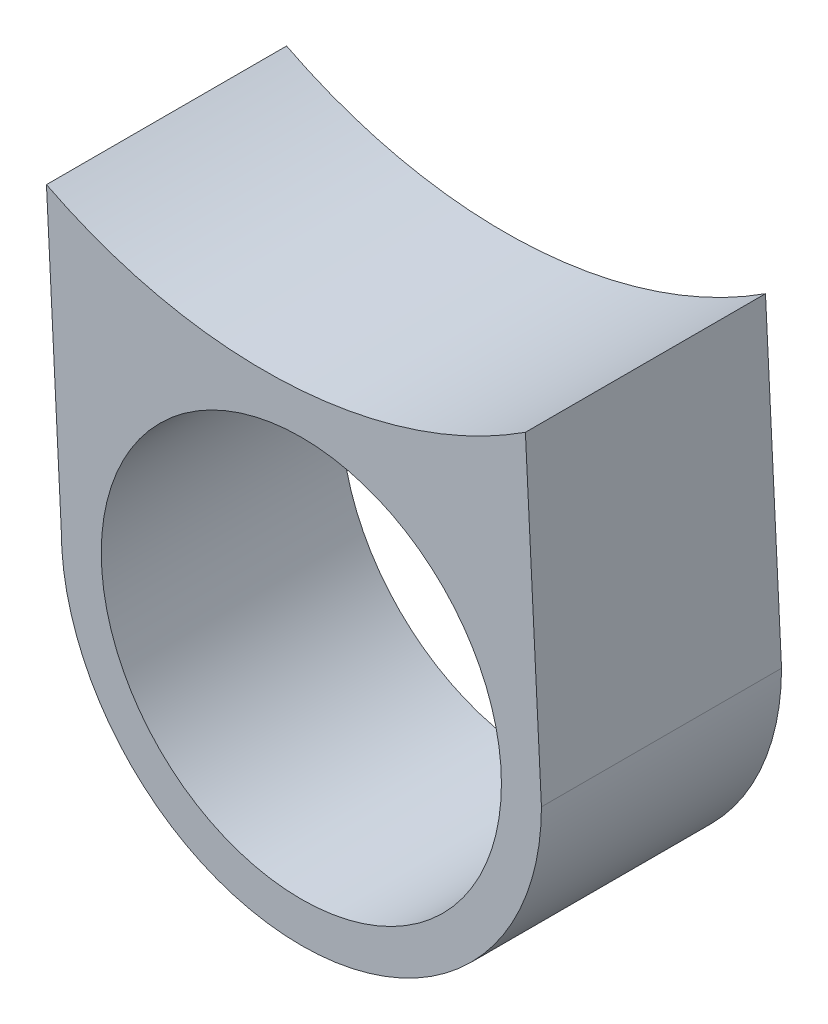
ISO-10303-21;
HEADER;
FILE_DESCRIPTION(('STEP AP214'),'2;1');
FILE_NAME('part.step','',(''),(''),'','','');
FILE_SCHEMA(('AUTOMOTIVE_DESIGN { 1 0 10303 214 1 1 1 1 }'));
ENDSEC;
DATA;
#1=APPLICATION_CONTEXT('core data for automotive mechanical design processes');
#2=APPLICATION_PROTOCOL_DEFINITION('international standard','automotive_design',2000,#1);
#3=PRODUCT_CONTEXT('',#1,'mechanical');
#4=PRODUCT('Part','Part','',(#3));
#5=PRODUCT_RELATED_PRODUCT_CATEGORY('part','',(#4));
#6=PRODUCT_DEFINITION_FORMATION('','',#4);
#7=PRODUCT_DEFINITION_CONTEXT('part definition',#1,'design');
#8=PRODUCT_DEFINITION('design','',#6,#7);
#9=PRODUCT_DEFINITION_SHAPE('','',#8);
#10=(LENGTH_UNIT() NAMED_UNIT(*) SI_UNIT(.MILLI.,.METRE.));
#11=(NAMED_UNIT(*) PLANE_ANGLE_UNIT() SI_UNIT($,.RADIAN.));
#12=(NAMED_UNIT(*) SI_UNIT($,.STERADIAN.) SOLID_ANGLE_UNIT());
#13=UNCERTAINTY_MEASURE_WITH_UNIT(LENGTH_MEASURE(1.E-05),#10,'distance_accuracy_value','');
#14=(GEOMETRIC_REPRESENTATION_CONTEXT(3) GLOBAL_UNCERTAINTY_ASSIGNED_CONTEXT((#13)) GLOBAL_UNIT_ASSIGNED_CONTEXT((#10,
#11,#12)) REPRESENTATION_CONTEXT('',''));
#15=CARTESIAN_POINT('',(0.,0.,0.));
#16=DIRECTION('',(0.,0.,1.));
#17=DIRECTION('',(1.,0.,0.));
#18=AXIS2_PLACEMENT_3D('',#15,#16,#17);
#19=CARTESIAN_POINT('',(-16.2806414312069,-0.825939888466545,5.));
#20=DIRECTION('',(-0.998715640654164,-0.0506662522073952,0.));
#21=DIRECTION('',(0.0506662522073952,-0.998715640654164,0.));
#22=AXIS2_PLACEMENT_3D('',#19,#20,#21);
#23=PLANE('',#22);
#24=DIRECTION('',(0.,0.,-1.));
#25=VECTOR('',#24,1.);
#26=CARTESIAN_POINT('',(-13.9656587133252,-46.4580785895613,5.));
#27=LINE('',#26,#25);
#28=CARTESIAN_POINT('',(-13.9656587133252,-46.4580785895613,5.));
#29=VERTEX_POINT('',#28);
#30=CARTESIAN_POINT('',(-13.9656587133252,-46.4580785895613,-10.));
#31=VERTEX_POINT('',#30);
#32=EDGE_CURVE('E96',#29,#31,#27,.T.);
#33=ORIENTED_EDGE('',*,*,#32,.T.);
#34=DIRECTION('',(-0.0506662522073952,0.998715640654164,0.));
#35=VECTOR('',#34,1.);
#36=CARTESIAN_POINT('',(-16.2806414312069,-0.825939888466545,-10.));
#37=LINE('',#36,#35);
#38=CARTESIAN_POINT('',(-14.9683043372396,-26.6942748146581,-10.));
#39=VERTEX_POINT('',#38);
#40=EDGE_CURVE('E92',#31,#39,#37,.T.);
#41=ORIENTED_EDGE('',*,*,#40,.T.);
#42=DIRECTION('',(0.,0.,-1.));
#43=VECTOR('',#42,1.);
#44=CARTESIAN_POINT('',(-14.9683043372396,-26.6942748146581,5.));
#45=LINE('',#44,#43);
#46=CARTESIAN_POINT('',(-14.9683043372396,-26.6942748146581,5.));
#47=VERTEX_POINT('',#46);
#48=EDGE_CURVE('E11',#47,#39,#45,.T.);
#49=ORIENTED_EDGE('',*,*,#48,.F.);
#50=DIRECTION('',(-0.0506662522073952,0.998715640654164,0.));
#51=VECTOR('',#50,1.);
#52=CARTESIAN_POINT('',(-16.2806414312069,-0.825939888466545,5.));
#53=LINE('',#52,#51);
#54=EDGE_CURVE('E105',#29,#47,#53,.T.);
#55=ORIENTED_EDGE('',*,*,#54,.F.);
#56=EDGE_LOOP('',(#33,#41,#49,#55));
#57=FACE_BOUND('',#56,.T.);
#58=ADVANCED_FACE('F37',(#57),#23,.F.);
#59=CARTESIAN_POINT('',(-31.2821708620277,-1.51774290473454,5.));
#60=DIRECTION('',(0.,0.,-1.));
#61=DIRECTION('',(-1.,0.,0.));
#62=AXIS2_PLACEMENT_3D('',#59,#60,#61);
#63=CYLINDRICAL_SURFACE('',#62,30.);
#64=ORIENTED_EDGE('',*,*,#48,.T.);
#65=CARTESIAN_POINT('',(-31.2821708620277,-1.51774290473454,-10.));
#66=DIRECTION('',(0.,0.,1.));
#67=DIRECTION('',(1.,0.,0.));
#68=AXIS2_PLACEMENT_3D('',#65,#66,#67);
#69=CIRCLE('',#68,30.);
#70=CARTESIAN_POINT('',(-44.8891559201739,-28.2544210384778,-10.));
#71=VERTEX_POINT('',#70);
#72=EDGE_CURVE('E80',#71,#39,#69,.T.);
#73=ORIENTED_EDGE('',*,*,#72,.F.);
#74=DIRECTION('',(0.,0.,-1.));
#75=VECTOR('',#74,1.);
#76=CARTESIAN_POINT('',(-44.8891559201739,-28.2544210384778,5.));
#77=LINE('',#76,#75);
#78=CARTESIAN_POINT('',(-44.8891559201739,-28.2544210384778,5.));
#79=VERTEX_POINT('',#78);
#80=EDGE_CURVE('E44',#79,#71,#77,.T.);
#81=ORIENTED_EDGE('',*,*,#80,.F.);
#82=CARTESIAN_POINT('',(-31.2821708620277,-1.51774290473454,5.));
#83=DIRECTION('',(0.,0.,1.));
#84=DIRECTION('',(1.,0.,0.));
#85=AXIS2_PLACEMENT_3D('',#82,#83,#84);
#86=CIRCLE('',#85,30.);
#87=EDGE_CURVE('E82',#79,#47,#86,.T.);
#88=ORIENTED_EDGE('',*,*,#87,.T.);
#89=EDGE_LOOP('',(#64,#73,#81,#88));
#90=FACE_BOUND('',#89,.T.);
#91=ADVANCED_FACE('F79',(#90),#63,.F.);
#92=CARTESIAN_POINT('',(-46.2036293578246,-2.34397524445217,5.));
#93=DIRECTION('',(-0.998715640654164,-0.0506662522073951,0.));
#94=DIRECTION('',(0.0506662522073951,-0.998715640654164,0.));
#95=AXIS2_PLACEMENT_3D('',#92,#93,#94);
#96=PLANE('',#95);
#97=ORIENTED_EDGE('',*,*,#80,.T.);
#98=DIRECTION('',(-0.0506662522073951,0.998715640654164,0.));
#99=VECTOR('',#98,1.);
#100=CARTESIAN_POINT('',(-46.2036293578246,-2.34397524445217,-10.));
#101=LINE('',#100,#99);
#102=CARTESIAN_POINT('',(-43.9656587133252,-46.4580785895613,-10.));
#103=VERTEX_POINT('',#102);
#104=EDGE_CURVE('E94',#103,#71,#101,.T.);
#105=ORIENTED_EDGE('',*,*,#104,.F.);
#106=DIRECTION('',(0.,0.,-1.));
#107=VECTOR('',#106,1.);
#108=CARTESIAN_POINT('',(-43.9656587133252,-46.4580785895613,5.));
#109=LINE('',#108,#107);
#110=CARTESIAN_POINT('',(-43.9656587133252,-46.4580785895613,5.));
#111=VERTEX_POINT('',#110);
#112=EDGE_CURVE('E59',#111,#103,#109,.T.);
#113=ORIENTED_EDGE('',*,*,#112,.F.);
#114=DIRECTION('',(-0.0506662522073951,0.998715640654164,0.));
#115=VECTOR('',#114,1.);
#116=CARTESIAN_POINT('',(-46.2036293578246,-2.34397524445217,5.));
#117=LINE('',#116,#115);
#118=EDGE_CURVE('E108',#111,#79,#117,.T.);
#119=ORIENTED_EDGE('',*,*,#118,.T.);
#120=EDGE_LOOP('',(#97,#105,#113,#119));
#121=FACE_BOUND('',#120,.T.);
#122=ADVANCED_FACE('F115',(#121),#96,.T.);
#123=CARTESIAN_POINT('',(-28.9656587133252,-46.4580785895613,5.));
#124=DIRECTION('',(0.,0.,-1.));
#125=DIRECTION('',(-1.,0.,0.));
#126=AXIS2_PLACEMENT_3D('',#123,#124,#125);
#127=CYLINDRICAL_SURFACE('',#126,15.);
#128=ORIENTED_EDGE('',*,*,#112,.T.);
#129=CARTESIAN_POINT('',(-28.9656587133252,-46.4580785895613,-10.));
#130=DIRECTION('',(0.,0.,1.));
#131=DIRECTION('',(1.,0.,0.));
#132=AXIS2_PLACEMENT_3D('',#129,#130,#131);
#133=CIRCLE('',#132,15.);
#134=EDGE_CURVE('E100',#103,#31,#133,.T.);
#135=ORIENTED_EDGE('',*,*,#134,.T.);
#136=ORIENTED_EDGE('',*,*,#32,.F.);
#137=CARTESIAN_POINT('',(-28.9656587133252,-46.4580785895613,5.));
#138=DIRECTION('',(0.,0.,1.));
#139=DIRECTION('',(1.,0.,0.));
#140=AXIS2_PLACEMENT_3D('',#137,#138,#139);
#141=CIRCLE('',#140,15.);
#142=EDGE_CURVE('E51',#111,#29,#141,.T.);
#143=ORIENTED_EDGE('',*,*,#142,.F.);
#144=EDGE_LOOP('',(#128,#135,#136,#143));
#145=FACE_BOUND('',#144,.T.);
#146=ADVANCED_FACE('F125',(#145),#127,.T.);
#147=CARTESIAN_POINT('',(-28.9656587133252,-46.4580785895613,5.));
#148=DIRECTION('',(0.,0.,-1.));
#149=DIRECTION('',(-1.,0.,0.));
#150=AXIS2_PLACEMENT_3D('',#147,#148,#149);
#151=CYLINDRICAL_SURFACE('',#150,12.5);
#152=CARTESIAN_POINT('',(-28.9656587133252,-46.4580785895613,5.));
#153=DIRECTION('',(0.,0.,1.));
#154=DIRECTION('',(1.,0.,0.));
#155=AXIS2_PLACEMENT_3D('',#152,#153,#154);
#156=CIRCLE('',#155,12.5);
#157=CARTESIAN_POINT('',(-16.4656587133252,-46.4580785895613,5.));
#158=VERTEX_POINT('',#157);
#159=EDGE_CURVE('E111',#158,#158,#156,.T.);
#160=ORIENTED_EDGE('',*,*,#159,.T.);
#161=EDGE_LOOP('',(#160));
#162=FACE_BOUND('',#161,.T.);
#163=CARTESIAN_POINT('',(-28.9656587133252,-46.4580785895613,-10.));
#164=DIRECTION('',(0.,0.,1.));
#165=DIRECTION('',(1.,0.,0.));
#166=AXIS2_PLACEMENT_3D('',#163,#164,#165);
#167=CIRCLE('',#166,12.5);
#168=CARTESIAN_POINT('',(-16.4656587133252,-46.4580785895613,-10.));
#169=VERTEX_POINT('',#168);
#170=EDGE_CURVE('E102',#169,#169,#167,.T.);
#171=ORIENTED_EDGE('',*,*,#170,.F.);
#172=EDGE_LOOP('',(#171));
#173=FACE_BOUND('',#172,.T.);
#174=ADVANCED_FACE('F119',(#162,#173),#151,.F.);
#175=CARTESIAN_POINT('',(0.,0.,5.));
#176=DIRECTION('',(0.,0.,1.));
#177=DIRECTION('',(1.,0.,0.));
#178=AXIS2_PLACEMENT_3D('',#175,#176,#177);
#179=PLANE('',#178);
#180=ORIENTED_EDGE('',*,*,#54,.T.);
#181=ORIENTED_EDGE('',*,*,#87,.F.);
#182=ORIENTED_EDGE('',*,*,#118,.F.);
#183=ORIENTED_EDGE('',*,*,#142,.T.);
#184=EDGE_LOOP('',(#180,#181,#182,#183));
#185=FACE_BOUND('',#184,.T.);
#186=ORIENTED_EDGE('',*,*,#159,.F.);
#187=EDGE_LOOP('',(#186));
#188=FACE_BOUND('',#187,.T.);
#189=ADVANCED_FACE('F116',(#185,#188),#179,.T.);
#190=CARTESIAN_POINT('',(0.,0.,-10.));
#191=DIRECTION('',(0.,0.,1.));
#192=DIRECTION('',(1.,0.,0.));
#193=AXIS2_PLACEMENT_3D('',#190,#191,#192);
#194=PLANE('',#193);
#195=ORIENTED_EDGE('',*,*,#40,.F.);
#196=ORIENTED_EDGE('',*,*,#134,.F.);
#197=ORIENTED_EDGE('',*,*,#104,.T.);
#198=ORIENTED_EDGE('',*,*,#72,.T.);
#199=EDGE_LOOP('',(#195,#196,#197,#198));
#200=FACE_BOUND('',#199,.T.);
#201=ORIENTED_EDGE('',*,*,#170,.T.);
#202=EDGE_LOOP('',(#201));
#203=FACE_BOUND('',#202,.T.);
#204=ADVANCED_FACE('F89',(#200,#203),#194,.F.);
#205=CLOSED_SHELL('',(#58,#91,#122,#146,#174,#189,#204));
#206=MANIFOLD_SOLID_BREP('B2',#205);
#207=ADVANCED_BREP_SHAPE_REPRESENTATION('',(#18,#206),#14);
#208=SHAPE_DEFINITION_REPRESENTATION(#9,#207);
ENDSEC;
END-ISO-10303-21;
